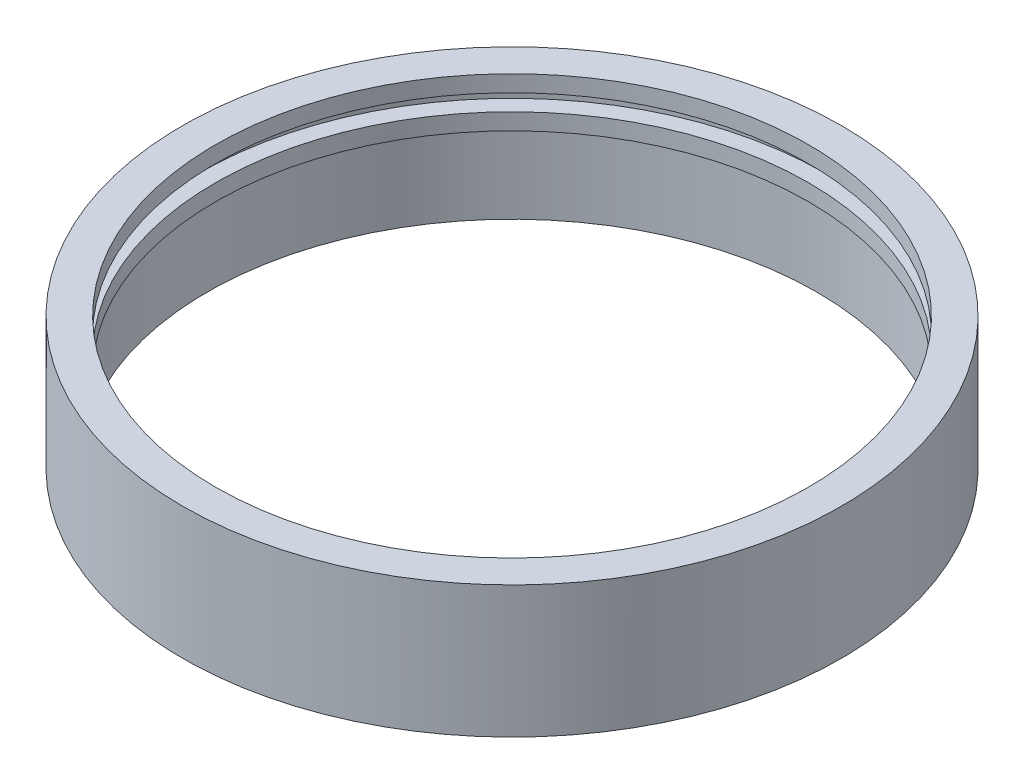
ISO-10303-21;
HEADER;
FILE_DESCRIPTION(('STEP AP214'),'2;1');
FILE_NAME('part.step','',(''),(''),'','','');
FILE_SCHEMA(('AUTOMOTIVE_DESIGN { 1 0 10303 214 1 1 1 1 }'));
ENDSEC;
DATA;
#1=APPLICATION_CONTEXT('core data for automotive mechanical design processes');
#2=APPLICATION_PROTOCOL_DEFINITION('international standard','automotive_design',2000,#1);
#3=PRODUCT_CONTEXT('',#1,'mechanical');
#4=PRODUCT('Part','Part','',(#3));
#5=PRODUCT_RELATED_PRODUCT_CATEGORY('part','',(#4));
#6=PRODUCT_DEFINITION_FORMATION('','',#4);
#7=PRODUCT_DEFINITION_CONTEXT('part definition',#1,'design');
#8=PRODUCT_DEFINITION('design','',#6,#7);
#9=PRODUCT_DEFINITION_SHAPE('','',#8);
#10=(LENGTH_UNIT() NAMED_UNIT(*) SI_UNIT(.MILLI.,.METRE.));
#11=(NAMED_UNIT(*) PLANE_ANGLE_UNIT() SI_UNIT($,.RADIAN.));
#12=(NAMED_UNIT(*) SI_UNIT($,.STERADIAN.) SOLID_ANGLE_UNIT());
#13=UNCERTAINTY_MEASURE_WITH_UNIT(LENGTH_MEASURE(1.E-05),#10,'distance_accuracy_value','');
#14=(GEOMETRIC_REPRESENTATION_CONTEXT(3) GLOBAL_UNCERTAINTY_ASSIGNED_CONTEXT((#13)) GLOBAL_UNIT_ASSIGNED_CONTEXT((#10,
#11,#12)) REPRESENTATION_CONTEXT('',''));
#15=CARTESIAN_POINT('',(0.,0.,0.));
#16=DIRECTION('',(0.,0.,1.));
#17=DIRECTION('',(1.,0.,0.));
#18=AXIS2_PLACEMENT_3D('',#15,#16,#17);
#19=CARTESIAN_POINT('',(0.,-2.,0.));
#20=DIRECTION('',(0.,-1.,0.));
#21=DIRECTION('',(0.,0.,-1.));
#22=AXIS2_PLACEMENT_3D('',#19,#20,#21);
#23=PLANE('',#22);
#24=CARTESIAN_POINT('',(0.,-2.,0.));
#25=DIRECTION('',(0.,-1.,0.));
#26=DIRECTION('',(0.,0.,-1.));
#27=AXIS2_PLACEMENT_3D('',#24,#25,#26);
#28=CIRCLE('',#27,18.);
#29=CARTESIAN_POINT('',(0.,-2.,-18.));
#30=VERTEX_POINT('',#29);
#31=EDGE_CURVE('E60',#30,#30,#28,.T.);
#32=ORIENTED_EDGE('',*,*,#31,.F.);
#33=EDGE_LOOP('',(#32));
#34=FACE_BOUND('',#33,.T.);
#35=CARTESIAN_POINT('',(0.,-2.,0.));
#36=DIRECTION('',(0.,-1.,0.));
#37=DIRECTION('',(0.,0.,-1.));
#38=AXIS2_PLACEMENT_3D('',#35,#36,#37);
#39=CIRCLE('',#38,18.5);
#40=CARTESIAN_POINT('',(0.,-2.,-18.5));
#41=VERTEX_POINT('',#40);
#42=EDGE_CURVE('E70',#41,#41,#39,.T.);
#43=ORIENTED_EDGE('',*,*,#42,.T.);
#44=EDGE_LOOP('',(#43));
#45=FACE_BOUND('',#44,.T.);
#46=ADVANCED_FACE('F37',(#34,#45),#23,.T.);
#47=CARTESIAN_POINT('',(0.,0.,0.));
#48=DIRECTION('',(0.,1.,0.));
#49=DIRECTION('',(0.,0.,1.));
#50=AXIS2_PLACEMENT_3D('',#47,#48,#49);
#51=PLANE('',#50);
#52=CARTESIAN_POINT('',(0.,0.,0.));
#53=DIRECTION('',(0.,1.,0.));
#54=DIRECTION('',(0.,0.,1.));
#55=AXIS2_PLACEMENT_3D('',#52,#53,#54);
#56=CIRCLE('',#55,18.);
#57=CARTESIAN_POINT('',(0.,0.,18.));
#58=VERTEX_POINT('',#57);
#59=EDGE_CURVE('E48',#58,#58,#56,.T.);
#60=ORIENTED_EDGE('',*,*,#59,.T.);
#61=EDGE_LOOP('',(#60));
#62=FACE_BOUND('',#61,.T.);
#63=CARTESIAN_POINT('',(0.,0.,0.));
#64=DIRECTION('',(0.,-1.,0.));
#65=DIRECTION('',(0.,0.,-1.));
#66=AXIS2_PLACEMENT_3D('',#63,#64,#65);
#67=CIRCLE('',#66,19.);
#68=CARTESIAN_POINT('',(0.,0.,-19.));
#69=VERTEX_POINT('',#68);
#70=EDGE_CURVE('E53',#69,#69,#67,.T.);
#71=ORIENTED_EDGE('',*,*,#70,.T.);
#72=EDGE_LOOP('',(#71));
#73=FACE_BOUND('',#72,.T.);
#74=ADVANCED_FACE('F94',(#62,#73),#51,.F.);
#75=CARTESIAN_POINT('',(0.,1.,0.));
#76=DIRECTION('',(0.,1.,0.));
#77=DIRECTION('',(0.,0.,1.));
#78=AXIS2_PLACEMENT_3D('',#75,#76,#77);
#79=PLANE('',#78);
#80=CARTESIAN_POINT('',(0.,1.,0.));
#81=DIRECTION('',(0.,1.,0.));
#82=DIRECTION('',(0.,0.,1.));
#83=AXIS2_PLACEMENT_3D('',#80,#81,#82);
#84=CIRCLE('',#83,20.);
#85=CARTESIAN_POINT('',(0.,1.,20.));
#86=VERTEX_POINT('',#85);
#87=EDGE_CURVE('E10',#86,#86,#84,.T.);
#88=ORIENTED_EDGE('',*,*,#87,.T.);
#89=EDGE_LOOP('',(#88));
#90=FACE_BOUND('',#89,.T.);
#91=CARTESIAN_POINT('',(0.,1.,0.));
#92=DIRECTION('',(0.,1.,0.));
#93=DIRECTION('',(0.,0.,1.));
#94=AXIS2_PLACEMENT_3D('',#91,#92,#93);
#95=CIRCLE('',#94,18.);
#96=CARTESIAN_POINT('',(0.,1.,18.));
#97=VERTEX_POINT('',#96);
#98=EDGE_CURVE('E44',#97,#97,#95,.T.);
#99=ORIENTED_EDGE('',*,*,#98,.F.);
#100=EDGE_LOOP('',(#99));
#101=FACE_BOUND('',#100,.T.);
#102=ADVANCED_FACE('F100',(#90,#101),#79,.T.);
#103=CARTESIAN_POINT('',(0.,1.,0.));
#104=DIRECTION('',(0.,-1.,0.));
#105=DIRECTION('',(0.,0.,-1.));
#106=AXIS2_PLACEMENT_3D('',#103,#104,#105);
#107=CYLINDRICAL_SURFACE('',#106,20.);
#108=ORIENTED_EDGE('',*,*,#87,.F.);
#109=EDGE_LOOP('',(#108));
#110=FACE_BOUND('',#109,.T.);
#111=CARTESIAN_POINT('',(0.,-7.,0.));
#112=DIRECTION('',(0.,-1.,0.));
#113=DIRECTION('',(0.,0.,-1.));
#114=AXIS2_PLACEMENT_3D('',#111,#112,#113);
#115=CIRCLE('',#114,20.);
#116=CARTESIAN_POINT('',(0.,-7.,-20.));
#117=VERTEX_POINT('',#116);
#118=EDGE_CURVE('E64',#117,#117,#115,.T.);
#119=ORIENTED_EDGE('',*,*,#118,.F.);
#120=EDGE_LOOP('',(#119));
#121=FACE_BOUND('',#120,.T.);
#122=ADVANCED_FACE('F39',(#110,#121),#107,.T.);
#123=CARTESIAN_POINT('',(0.,1.,0.));
#124=DIRECTION('',(0.,-1.,0.));
#125=DIRECTION('',(0.,0.,-1.));
#126=AXIS2_PLACEMENT_3D('',#123,#124,#125);
#127=CYLINDRICAL_SURFACE('',#126,18.);
#128=ORIENTED_EDGE('',*,*,#98,.T.);
#129=EDGE_LOOP('',(#128));
#130=FACE_BOUND('',#129,.T.);
#131=ORIENTED_EDGE('',*,*,#59,.F.);
#132=EDGE_LOOP('',(#131));
#133=FACE_BOUND('',#132,.T.);
#134=ADVANCED_FACE('F111',(#130,#133),#127,.F.);
#135=CARTESIAN_POINT('',(0.,-1.,0.));
#136=DIRECTION('',(0.,1.,0.));
#137=DIRECTION('',(0.,0.,1.));
#138=AXIS2_PLACEMENT_3D('',#135,#136,#137);
#139=CYLINDRICAL_SURFACE('',#138,19.);
#140=CARTESIAN_POINT('',(0.,-1.,0.));
#141=DIRECTION('',(0.,-1.,0.));
#142=DIRECTION('',(0.,0.,-1.));
#143=AXIS2_PLACEMENT_3D('',#140,#141,#142);
#144=CIRCLE('',#143,19.);
#145=CARTESIAN_POINT('',(0.,-1.,-19.));
#146=VERTEX_POINT('',#145);
#147=EDGE_CURVE('E57',#146,#146,#144,.T.);
#148=ORIENTED_EDGE('',*,*,#147,.T.);
#149=EDGE_LOOP('',(#148));
#150=FACE_BOUND('',#149,.T.);
#151=ORIENTED_EDGE('',*,*,#70,.F.);
#152=EDGE_LOOP('',(#151));
#153=FACE_BOUND('',#152,.T.);
#154=ADVANCED_FACE('F107',(#150,#153),#139,.F.);
#155=CARTESIAN_POINT('',(0.,-1.,0.));
#156=DIRECTION('',(0.,-1.,0.));
#157=DIRECTION('',(0.,0.,-1.));
#158=AXIS2_PLACEMENT_3D('',#155,#156,#157);
#159=PLANE('',#158);
#160=CARTESIAN_POINT('',(0.,-1.,0.));
#161=DIRECTION('',(0.,-1.,0.));
#162=DIRECTION('',(0.,0.,-1.));
#163=AXIS2_PLACEMENT_3D('',#160,#161,#162);
#164=CIRCLE('',#163,18.);
#165=CARTESIAN_POINT('',(0.,-1.,-18.));
#166=VERTEX_POINT('',#165);
#167=EDGE_CURVE('E61',#166,#166,#164,.T.);
#168=ORIENTED_EDGE('',*,*,#167,.T.);
#169=EDGE_LOOP('',(#168));
#170=FACE_BOUND('',#169,.T.);
#171=ORIENTED_EDGE('',*,*,#147,.F.);
#172=EDGE_LOOP('',(#171));
#173=FACE_BOUND('',#172,.T.);
#174=ADVANCED_FACE('F90',(#170,#173),#159,.F.);
#175=CARTESIAN_POINT('',(0.,-2.,0.));
#176=DIRECTION('',(0.,1.,0.));
#177=DIRECTION('',(0.,0.,1.));
#178=AXIS2_PLACEMENT_3D('',#175,#176,#177);
#179=CYLINDRICAL_SURFACE('',#178,18.);
#180=ORIENTED_EDGE('',*,*,#31,.T.);
#181=EDGE_LOOP('',(#180));
#182=FACE_BOUND('',#181,.T.);
#183=ORIENTED_EDGE('',*,*,#167,.F.);
#184=EDGE_LOOP('',(#183));
#185=FACE_BOUND('',#184,.T.);
#186=ADVANCED_FACE('F81',(#182,#185),#179,.F.);
#187=CARTESIAN_POINT('',(0.,-7.,0.));
#188=DIRECTION('',(0.,-1.,0.));
#189=DIRECTION('',(0.,0.,-1.));
#190=AXIS2_PLACEMENT_3D('',#187,#188,#189);
#191=PLANE('',#190);
#192=ORIENTED_EDGE('',*,*,#118,.T.);
#193=EDGE_LOOP('',(#192));
#194=FACE_BOUND('',#193,.T.);
#195=CARTESIAN_POINT('',(0.,-7.,0.));
#196=DIRECTION('',(0.,-1.,0.));
#197=DIRECTION('',(0.,0.,-1.));
#198=AXIS2_PLACEMENT_3D('',#195,#196,#197);
#199=CIRCLE('',#198,18.5);
#200=CARTESIAN_POINT('',(0.,-7.,-18.5));
#201=VERTEX_POINT('',#200);
#202=EDGE_CURVE('E69',#201,#201,#199,.T.);
#203=ORIENTED_EDGE('',*,*,#202,.F.);
#204=EDGE_LOOP('',(#203));
#205=FACE_BOUND('',#204,.T.);
#206=ADVANCED_FACE('F79',(#194,#205),#191,.T.);
#207=CARTESIAN_POINT('',(0.,-7.,0.));
#208=DIRECTION('',(0.,1.,0.));
#209=DIRECTION('',(0.,0.,1.));
#210=AXIS2_PLACEMENT_3D('',#207,#208,#209);
#211=CYLINDRICAL_SURFACE('',#210,18.5);
#212=ORIENTED_EDGE('',*,*,#202,.T.);
#213=EDGE_LOOP('',(#212));
#214=FACE_BOUND('',#213,.T.);
#215=ORIENTED_EDGE('',*,*,#42,.F.);
#216=EDGE_LOOP('',(#215));
#217=FACE_BOUND('',#216,.T.);
#218=ADVANCED_FACE('F76',(#214,#217),#211,.F.);
#219=CLOSED_SHELL('',(#46,#74,#102,#122,#134,#154,#174,#186,#206,#218));
#220=MANIFOLD_SOLID_BREP('B2',#219);
#221=ADVANCED_BREP_SHAPE_REPRESENTATION('',(#18,#220),#14);
#222=SHAPE_DEFINITION_REPRESENTATION(#9,#221);
ENDSEC;
END-ISO-10303-21;
